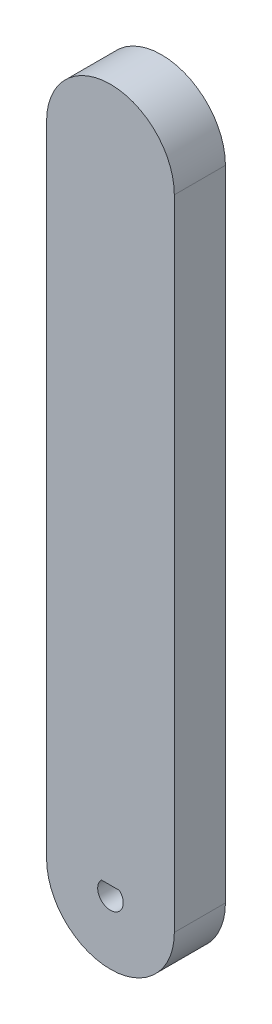
ISO-10303-21;
HEADER;
FILE_DESCRIPTION(('STEP AP214'),'2;1');
FILE_NAME('part.step','',(''),(''),'','','');
FILE_SCHEMA(('AUTOMOTIVE_DESIGN { 1 0 10303 214 1 1 1 1 }'));
ENDSEC;
DATA;
#1=APPLICATION_CONTEXT('core data for automotive mechanical design processes');
#2=APPLICATION_PROTOCOL_DEFINITION('international standard','automotive_design',2000,#1);
#3=PRODUCT_CONTEXT('',#1,'mechanical');
#4=PRODUCT('Part','Part','',(#3));
#5=PRODUCT_RELATED_PRODUCT_CATEGORY('part','',(#4));
#6=PRODUCT_DEFINITION_FORMATION('','',#4);
#7=PRODUCT_DEFINITION_CONTEXT('part definition',#1,'design');
#8=PRODUCT_DEFINITION('design','',#6,#7);
#9=PRODUCT_DEFINITION_SHAPE('','',#8);
#10=(LENGTH_UNIT() NAMED_UNIT(*) SI_UNIT(.MILLI.,.METRE.));
#11=(NAMED_UNIT(*) PLANE_ANGLE_UNIT() SI_UNIT($,.RADIAN.));
#12=(NAMED_UNIT(*) SI_UNIT($,.STERADIAN.) SOLID_ANGLE_UNIT());
#13=UNCERTAINTY_MEASURE_WITH_UNIT(LENGTH_MEASURE(1.E-05),#10,'distance_accuracy_value','');
#14=(GEOMETRIC_REPRESENTATION_CONTEXT(3) GLOBAL_UNCERTAINTY_ASSIGNED_CONTEXT((#13)) GLOBAL_UNIT_ASSIGNED_CONTEXT((#10,
#11,#12)) REPRESENTATION_CONTEXT('',''));
#15=CARTESIAN_POINT('',(0.,0.,0.));
#16=DIRECTION('',(0.,0.,1.));
#17=DIRECTION('',(1.,0.,0.));
#18=AXIS2_PLACEMENT_3D('',#15,#16,#17);
#19=CARTESIAN_POINT('',(10.,0.,8.));
#20=DIRECTION('',(1.,0.,0.));
#21=DIRECTION('',(0.,0.,-1.));
#22=AXIS2_PLACEMENT_3D('',#19,#20,#21);
#23=PLANE('',#22);
#24=DIRECTION('',(0.,-1.,0.));
#25=VECTOR('',#24,1.);
#26=CARTESIAN_POINT('',(10.,0.,0.));
#27=LINE('',#26,#25);
#28=CARTESIAN_POINT('',(10.,100.,0.));
#29=VERTEX_POINT('',#28);
#30=CARTESIAN_POINT('',(10.,0.,0.));
#31=VERTEX_POINT('',#30);
#32=EDGE_CURVE('E151',#29,#31,#27,.T.);
#33=ORIENTED_EDGE('',*,*,#32,.F.);
#34=DIRECTION('',(0.,0.,-1.));
#35=VECTOR('',#34,1.);
#36=CARTESIAN_POINT('',(10.,100.,8.));
#37=LINE('',#36,#35);
#38=CARTESIAN_POINT('',(10.,100.,8.));
#39=VERTEX_POINT('',#38);
#40=EDGE_CURVE('E11',#39,#29,#37,.T.);
#41=ORIENTED_EDGE('',*,*,#40,.F.);
#42=DIRECTION('',(0.,-1.,0.));
#43=VECTOR('',#42,1.);
#44=CARTESIAN_POINT('',(10.,0.,8.));
#45=LINE('',#44,#43);
#46=CARTESIAN_POINT('',(10.,0.,8.));
#47=VERTEX_POINT('',#46);
#48=EDGE_CURVE('E124',#39,#47,#45,.T.);
#49=ORIENTED_EDGE('',*,*,#48,.T.);
#50=DIRECTION('',(0.,0.,-1.));
#51=VECTOR('',#50,1.);
#52=CARTESIAN_POINT('',(10.,0.,8.));
#53=LINE('',#52,#51);
#54=EDGE_CURVE('E95',#47,#31,#53,.T.);
#55=ORIENTED_EDGE('',*,*,#54,.T.);
#56=EDGE_LOOP('',(#33,#41,#49,#55));
#57=FACE_BOUND('',#56,.T.);
#58=ADVANCED_FACE('F47',(#57),#23,.T.);
#59=CARTESIAN_POINT('',(0.,100.,8.));
#60=DIRECTION('',(0.,0.,-1.));
#61=DIRECTION('',(-1.,0.,0.));
#62=AXIS2_PLACEMENT_3D('',#59,#60,#61);
#63=CYLINDRICAL_SURFACE('',#62,10.);
#64=CARTESIAN_POINT('',(0.,100.,0.));
#65=DIRECTION('',(0.,0.,1.));
#66=DIRECTION('',(1.,0.,0.));
#67=AXIS2_PLACEMENT_3D('',#64,#65,#66);
#68=CIRCLE('',#67,10.);
#69=CARTESIAN_POINT('',(-10.,100.,0.));
#70=VERTEX_POINT('',#69);
#71=EDGE_CURVE('E130',#29,#70,#68,.T.);
#72=ORIENTED_EDGE('',*,*,#71,.T.);
#73=DIRECTION('',(0.,0.,-1.));
#74=VECTOR('',#73,1.);
#75=CARTESIAN_POINT('',(-10.,100.,8.));
#76=LINE('',#75,#74);
#77=CARTESIAN_POINT('',(-10.,100.,8.));
#78=VERTEX_POINT('',#77);
#79=EDGE_CURVE('E58',#78,#70,#76,.T.);
#80=ORIENTED_EDGE('',*,*,#79,.F.);
#81=CARTESIAN_POINT('',(0.,100.,8.));
#82=DIRECTION('',(0.,0.,1.));
#83=DIRECTION('',(1.,0.,0.));
#84=AXIS2_PLACEMENT_3D('',#81,#82,#83);
#85=CIRCLE('',#84,10.);
#86=EDGE_CURVE('E120',#39,#78,#85,.T.);
#87=ORIENTED_EDGE('',*,*,#86,.F.);
#88=ORIENTED_EDGE('',*,*,#40,.T.);
#89=EDGE_LOOP('',(#72,#80,#87,#88));
#90=FACE_BOUND('',#89,.T.);
#91=ADVANCED_FACE('F128',(#90),#63,.T.);
#92=CARTESIAN_POINT('',(-10.,0.,8.));
#93=DIRECTION('',(1.,0.,0.));
#94=DIRECTION('',(0.,0.,-1.));
#95=AXIS2_PLACEMENT_3D('',#92,#93,#94);
#96=PLANE('',#95);
#97=DIRECTION('',(0.,-1.,0.));
#98=VECTOR('',#97,1.);
#99=CARTESIAN_POINT('',(-10.,0.,0.));
#100=LINE('',#99,#98);
#101=CARTESIAN_POINT('',(-10.,0.,0.));
#102=VERTEX_POINT('',#101);
#103=EDGE_CURVE('E156',#70,#102,#100,.T.);
#104=ORIENTED_EDGE('',*,*,#103,.T.);
#105=DIRECTION('',(0.,0.,-1.));
#106=VECTOR('',#105,1.);
#107=CARTESIAN_POINT('',(-10.,0.,8.));
#108=LINE('',#107,#106);
#109=CARTESIAN_POINT('',(-10.,0.,8.));
#110=VERTEX_POINT('',#109);
#111=EDGE_CURVE('E118',#110,#102,#108,.T.);
#112=ORIENTED_EDGE('',*,*,#111,.F.);
#113=DIRECTION('',(0.,-1.,0.));
#114=VECTOR('',#113,1.);
#115=CARTESIAN_POINT('',(-10.,0.,8.));
#116=LINE('',#115,#114);
#117=EDGE_CURVE('E112',#78,#110,#116,.T.);
#118=ORIENTED_EDGE('',*,*,#117,.F.);
#119=ORIENTED_EDGE('',*,*,#79,.T.);
#120=EDGE_LOOP('',(#104,#112,#118,#119));
#121=FACE_BOUND('',#120,.T.);
#122=ADVANCED_FACE('F115',(#121),#96,.F.);
#123=CARTESIAN_POINT('',(0.,0.,8.));
#124=DIRECTION('',(0.,0.,-1.));
#125=DIRECTION('',(-1.,0.,0.));
#126=AXIS2_PLACEMENT_3D('',#123,#124,#125);
#127=CYLINDRICAL_SURFACE('',#126,2.);
#128=CARTESIAN_POINT('',(0.,0.,0.));
#129=DIRECTION('',(0.,0.,1.));
#130=DIRECTION('',(1.,0.,0.));
#131=AXIS2_PLACEMENT_3D('',#128,#129,#130);
#132=CIRCLE('',#131,2.);
#133=CARTESIAN_POINT('',(-1.42828568570857,1.4,0.));
#134=VERTEX_POINT('',#133);
#135=CARTESIAN_POINT('',(1.42828568570857,1.4,0.));
#136=VERTEX_POINT('',#135);
#137=EDGE_CURVE('E144',#134,#136,#132,.T.);
#138=ORIENTED_EDGE('',*,*,#137,.F.);
#139=DIRECTION('',(0.,0.,-1.));
#140=VECTOR('',#139,1.);
#141=CARTESIAN_POINT('',(-1.42828568570857,1.4,8.));
#142=LINE('',#141,#140);
#143=CARTESIAN_POINT('',(-1.42828568570857,1.4,8.));
#144=VERTEX_POINT('',#143);
#145=EDGE_CURVE('E51',#144,#134,#142,.T.);
#146=ORIENTED_EDGE('',*,*,#145,.F.);
#147=CARTESIAN_POINT('',(0.,0.,8.));
#148=DIRECTION('',(0.,0.,1.));
#149=DIRECTION('',(1.,0.,0.));
#150=AXIS2_PLACEMENT_3D('',#147,#148,#149);
#151=CIRCLE('',#150,2.);
#152=CARTESIAN_POINT('',(1.42828568570857,1.4,8.));
#153=VERTEX_POINT('',#152);
#154=EDGE_CURVE('E160',#144,#153,#151,.T.);
#155=ORIENTED_EDGE('',*,*,#154,.T.);
#156=DIRECTION('',(0.,0.,-1.));
#157=VECTOR('',#156,1.);
#158=CARTESIAN_POINT('',(1.42828568570857,1.4,8.));
#159=LINE('',#158,#157);
#160=EDGE_CURVE('E136',#153,#136,#159,.T.);
#161=ORIENTED_EDGE('',*,*,#160,.T.);
#162=EDGE_LOOP('',(#138,#146,#155,#161));
#163=FACE_BOUND('',#162,.T.);
#164=ADVANCED_FACE('F49',(#163),#127,.F.);
#165=CARTESIAN_POINT('',(0.,1.4,8.));
#166=DIRECTION('',(0.,1.,0.));
#167=DIRECTION('',(0.,0.,1.));
#168=AXIS2_PLACEMENT_3D('',#165,#166,#167);
#169=PLANE('',#168);
#170=DIRECTION('',(1.,0.,0.));
#171=VECTOR('',#170,1.);
#172=CARTESIAN_POINT('',(0.,1.4,0.));
#173=LINE('',#172,#171);
#174=EDGE_CURVE('E148',#134,#136,#173,.T.);
#175=ORIENTED_EDGE('',*,*,#174,.T.);
#176=ORIENTED_EDGE('',*,*,#160,.F.);
#177=DIRECTION('',(1.,0.,0.));
#178=VECTOR('',#177,1.);
#179=CARTESIAN_POINT('',(0.,1.4,8.));
#180=LINE('',#179,#178);
#181=EDGE_CURVE('E164',#144,#153,#180,.T.);
#182=ORIENTED_EDGE('',*,*,#181,.F.);
#183=ORIENTED_EDGE('',*,*,#145,.T.);
#184=EDGE_LOOP('',(#175,#176,#182,#183));
#185=FACE_BOUND('',#184,.T.);
#186=ADVANCED_FACE('F189',(#185),#169,.F.);
#187=CARTESIAN_POINT('',(0.,0.,8.));
#188=DIRECTION('',(0.,0.,-1.));
#189=DIRECTION('',(-1.,0.,0.));
#190=AXIS2_PLACEMENT_3D('',#187,#188,#189);
#191=CYLINDRICAL_SURFACE('',#190,10.);
#192=CARTESIAN_POINT('',(0.,0.,0.));
#193=DIRECTION('',(0.,0.,1.));
#194=DIRECTION('',(1.,0.,0.));
#195=AXIS2_PLACEMENT_3D('',#192,#193,#194);
#196=CIRCLE('',#195,10.);
#197=EDGE_CURVE('E88',#102,#31,#196,.T.);
#198=ORIENTED_EDGE('',*,*,#197,.T.);
#199=ORIENTED_EDGE('',*,*,#54,.F.);
#200=CARTESIAN_POINT('',(0.,0.,8.));
#201=DIRECTION('',(0.,0.,1.));
#202=DIRECTION('',(1.,0.,0.));
#203=AXIS2_PLACEMENT_3D('',#200,#201,#202);
#204=CIRCLE('',#203,10.);
#205=EDGE_CURVE('E67',#110,#47,#204,.T.);
#206=ORIENTED_EDGE('',*,*,#205,.F.);
#207=ORIENTED_EDGE('',*,*,#111,.T.);
#208=EDGE_LOOP('',(#198,#199,#206,#207));
#209=FACE_BOUND('',#208,.T.);
#210=ADVANCED_FACE('F178',(#209),#191,.T.);
#211=CARTESIAN_POINT('',(0.,0.,8.));
#212=DIRECTION('',(0.,0.,1.));
#213=DIRECTION('',(1.,0.,0.));
#214=AXIS2_PLACEMENT_3D('',#211,#212,#213);
#215=PLANE('',#214);
#216=ORIENTED_EDGE('',*,*,#154,.F.);
#217=ORIENTED_EDGE('',*,*,#181,.T.);
#218=EDGE_LOOP('',(#216,#217));
#219=FACE_BOUND('',#218,.T.);
#220=ORIENTED_EDGE('',*,*,#48,.F.);
#221=ORIENTED_EDGE('',*,*,#86,.T.);
#222=ORIENTED_EDGE('',*,*,#117,.T.);
#223=ORIENTED_EDGE('',*,*,#205,.T.);
#224=EDGE_LOOP('',(#220,#221,#222,#223));
#225=FACE_BOUND('',#224,.T.);
#226=ADVANCED_FACE('F123',(#219,#225),#215,.T.);
#227=CARTESIAN_POINT('',(0.,0.,0.));
#228=DIRECTION('',(0.,0.,1.));
#229=DIRECTION('',(1.,0.,0.));
#230=AXIS2_PLACEMENT_3D('',#227,#228,#229);
#231=PLANE('',#230);
#232=ORIENTED_EDGE('',*,*,#137,.T.);
#233=ORIENTED_EDGE('',*,*,#174,.F.);
#234=EDGE_LOOP('',(#232,#233));
#235=FACE_BOUND('',#234,.T.);
#236=ORIENTED_EDGE('',*,*,#32,.T.);
#237=ORIENTED_EDGE('',*,*,#197,.F.);
#238=ORIENTED_EDGE('',*,*,#103,.F.);
#239=ORIENTED_EDGE('',*,*,#71,.F.);
#240=EDGE_LOOP('',(#236,#237,#238,#239));
#241=FACE_BOUND('',#240,.T.);
#242=ADVANCED_FACE('F171',(#235,#241),#231,.F.);
#243=CLOSED_SHELL('',(#58,#91,#122,#164,#186,#210,#226,#242));
#244=MANIFOLD_SOLID_BREP('B2',#243);
#245=ADVANCED_BREP_SHAPE_REPRESENTATION('',(#18,#244),#14);
#246=SHAPE_DEFINITION_REPRESENTATION(#9,#245);
ENDSEC;
END-ISO-10303-21;
